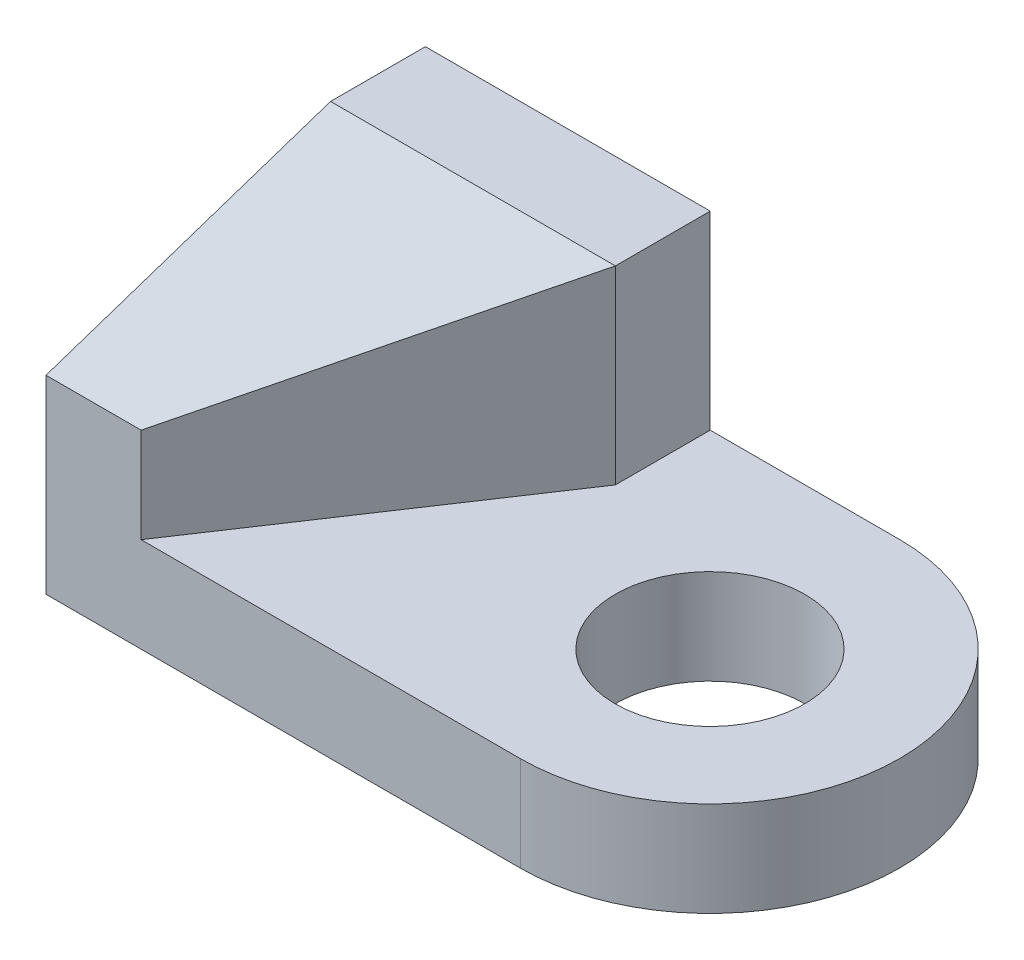
ISO-10303-21;
HEADER;
FILE_DESCRIPTION(('STEP AP214'),'2;1');
FILE_NAME('part.step','',(''),(''),'','','');
FILE_SCHEMA(('AUTOMOTIVE_DESIGN { 1 0 10303 214 1 1 1 1 }'));
ENDSEC;
DATA;
#1=APPLICATION_CONTEXT('core data for automotive mechanical design processes');
#2=APPLICATION_PROTOCOL_DEFINITION('international standard','automotive_design',2000,#1);
#3=PRODUCT_CONTEXT('',#1,'mechanical');
#4=PRODUCT('Part','Part','',(#3));
#5=PRODUCT_RELATED_PRODUCT_CATEGORY('part','',(#4));
#6=PRODUCT_DEFINITION_FORMATION('','',#4);
#7=PRODUCT_DEFINITION_CONTEXT('part definition',#1,'design');
#8=PRODUCT_DEFINITION('design','',#6,#7);
#9=PRODUCT_DEFINITION_SHAPE('','',#8);
#10=(LENGTH_UNIT() NAMED_UNIT(*) SI_UNIT(.MILLI.,.METRE.));
#11=(NAMED_UNIT(*) PLANE_ANGLE_UNIT() SI_UNIT($,.RADIAN.));
#12=(NAMED_UNIT(*) SI_UNIT($,.STERADIAN.) SOLID_ANGLE_UNIT());
#13=UNCERTAINTY_MEASURE_WITH_UNIT(LENGTH_MEASURE(1.E-05),#10,'distance_accuracy_value','');
#14=(GEOMETRIC_REPRESENTATION_CONTEXT(3) GLOBAL_UNCERTAINTY_ASSIGNED_CONTEXT((#13)) GLOBAL_UNIT_ASSIGNED_CONTEXT((#10,
#11,#12)) REPRESENTATION_CONTEXT('',''));
#15=CARTESIAN_POINT('',(0.,0.,0.));
#16=DIRECTION('',(0.,0.,1.));
#17=DIRECTION('',(1.,0.,0.));
#18=AXIS2_PLACEMENT_3D('',#15,#16,#17);
#19=CARTESIAN_POINT('',(-50.,10.,-20.));
#20=DIRECTION('',(1.,0.,0.));
#21=DIRECTION('',(0.,0.,-1.));
#22=AXIS2_PLACEMENT_3D('',#19,#20,#21);
#23=PLANE('',#22);
#24=DIRECTION('',(0.,-0.316227766016838,0.948683298050514));
#25=VECTOR('',#24,1.);
#26=CARTESIAN_POINT('',(-50.,31.,-13.));
#27=LINE('',#26,#25);
#28=CARTESIAN_POINT('',(-50.,30.,-10.));
#29=VERTEX_POINT('',#28);
#30=CARTESIAN_POINT('',(-50.,20.,20.));
#31=VERTEX_POINT('',#30);
#32=EDGE_CURVE('E141',#29,#31,#27,.T.);
#33=ORIENTED_EDGE('',*,*,#32,.F.);
#34=DIRECTION('',(0.,0.,-1.));
#35=VECTOR('',#34,1.);
#36=CARTESIAN_POINT('',(-50.,30.,20.));
#37=LINE('',#36,#35);
#38=CARTESIAN_POINT('',(-50.,30.,-20.));
#39=VERTEX_POINT('',#38);
#40=EDGE_CURVE('E150',#29,#39,#37,.T.);
#41=ORIENTED_EDGE('',*,*,#40,.T.);
#42=DIRECTION('',(0.,-1.,0.));
#43=VECTOR('',#42,1.);
#44=CARTESIAN_POINT('',(-50.,10.,-20.));
#45=LINE('',#44,#43);
#46=CARTESIAN_POINT('',(-50.,0.,-20.));
#47=VERTEX_POINT('',#46);
#48=EDGE_CURVE('E125',#39,#47,#45,.T.);
#49=ORIENTED_EDGE('',*,*,#48,.T.);
#50=DIRECTION('',(0.,0.,1.));
#51=VECTOR('',#50,1.);
#52=CARTESIAN_POINT('',(-50.,0.,-20.));
#53=LINE('',#52,#51);
#54=CARTESIAN_POINT('',(-50.,0.,20.));
#55=VERTEX_POINT('',#54);
#56=EDGE_CURVE('E97',#47,#55,#53,.T.);
#57=ORIENTED_EDGE('',*,*,#56,.T.);
#58=DIRECTION('',(0.,-1.,0.));
#59=VECTOR('',#58,1.);
#60=CARTESIAN_POINT('',(-50.,10.,20.));
#61=LINE('',#60,#59);
#62=EDGE_CURVE('E90',#31,#55,#61,.T.);
#63=ORIENTED_EDGE('',*,*,#62,.F.);
#64=EDGE_LOOP('',(#33,#41,#49,#57,#63));
#65=FACE_BOUND('',#64,.T.);
#66=ADVANCED_FACE('F40',(#65),#23,.F.);
#67=CARTESIAN_POINT('',(-50.,10.,20.));
#68=DIRECTION('',(0.,0.,-1.));
#69=DIRECTION('',(-1.,0.,0.));
#70=AXIS2_PLACEMENT_3D('',#67,#68,#69);
#71=PLANE('',#70);
#72=DIRECTION('',(1.,0.,0.));
#73=VECTOR('',#72,1.);
#74=CARTESIAN_POINT('',(-50.,10.,20.));
#75=LINE('',#74,#73);
#76=CARTESIAN_POINT('',(-39.9710585847802,10.,20.));
#77=VERTEX_POINT('',#76);
#78=CARTESIAN_POINT('',(0.,10.,20.));
#79=VERTEX_POINT('',#78);
#80=EDGE_CURVE('E64',#77,#79,#75,.T.);
#81=ORIENTED_EDGE('',*,*,#80,.F.);
#82=DIRECTION('',(0.,1.,0.));
#83=VECTOR('',#82,1.);
#84=CARTESIAN_POINT('',(-39.9710585847802,10.,20.));
#85=LINE('',#84,#83);
#86=CARTESIAN_POINT('',(-39.9710585847802,20.,20.));
#87=VERTEX_POINT('',#86);
#88=EDGE_CURVE('E195',#77,#87,#85,.T.);
#89=ORIENTED_EDGE('',*,*,#88,.T.);
#90=DIRECTION('',(1.,0.,0.));
#91=VECTOR('',#90,1.);
#92=CARTESIAN_POINT('',(-55.9710585847802,20.,20.));
#93=LINE('',#92,#91);
#94=EDGE_CURVE('E154',#31,#87,#93,.T.);
#95=ORIENTED_EDGE('',*,*,#94,.F.);
#96=ORIENTED_EDGE('',*,*,#62,.T.);
#97=DIRECTION('',(1.,0.,0.));
#98=VECTOR('',#97,1.);
#99=CARTESIAN_POINT('',(-50.,0.,20.));
#100=LINE('',#99,#98);
#101=CARTESIAN_POINT('',(0.,0.,20.));
#102=VERTEX_POINT('',#101);
#103=EDGE_CURVE('E83',#55,#102,#100,.T.);
#104=ORIENTED_EDGE('',*,*,#103,.T.);
#105=DIRECTION('',(0.,-1.,0.));
#106=VECTOR('',#105,1.);
#107=CARTESIAN_POINT('',(0.,10.,20.));
#108=LINE('',#107,#106);
#109=EDGE_CURVE('E86',#79,#102,#108,.T.);
#110=ORIENTED_EDGE('',*,*,#109,.F.);
#111=EDGE_LOOP('',(#81,#89,#95,#96,#104,#110));
#112=FACE_BOUND('',#111,.T.);
#113=ADVANCED_FACE('F85',(#112),#71,.F.);
#114=CARTESIAN_POINT('',(-19.9710585847802,30.,-20.));
#115=DIRECTION('',(1.,0.,0.));
#116=DIRECTION('',(0.,0.,-1.));
#117=AXIS2_PLACEMENT_3D('',#114,#115,#116);
#118=PLANE('',#117);
#119=DIRECTION('',(0.,1.,0.));
#120=VECTOR('',#119,1.);
#121=CARTESIAN_POINT('',(-19.9710585847802,10.,-10.));
#122=LINE('',#121,#120);
#123=CARTESIAN_POINT('',(-19.9710585847802,10.,-10.));
#124=VERTEX_POINT('',#123);
#125=CARTESIAN_POINT('',(-19.9710585847802,30.,-10.));
#126=VERTEX_POINT('',#125);
#127=EDGE_CURVE('E55',#124,#126,#122,.T.);
#128=ORIENTED_EDGE('',*,*,#127,.F.);
#129=DIRECTION('',(0.,0.,1.));
#130=VECTOR('',#129,1.);
#131=CARTESIAN_POINT('',(-19.9710585847802,10.,-20.));
#132=LINE('',#131,#130);
#133=CARTESIAN_POINT('',(-19.9710585847802,10.,-20.));
#134=VERTEX_POINT('',#133);
#135=EDGE_CURVE('E153',#134,#124,#132,.T.);
#136=ORIENTED_EDGE('',*,*,#135,.F.);
#137=DIRECTION('',(0.,-1.,0.));
#138=VECTOR('',#137,1.);
#139=CARTESIAN_POINT('',(-19.9710585847802,30.,-20.));
#140=LINE('',#139,#138);
#141=CARTESIAN_POINT('',(-19.9710585847802,30.,-20.));
#142=VERTEX_POINT('',#141);
#143=EDGE_CURVE('E161',#142,#134,#140,.T.);
#144=ORIENTED_EDGE('',*,*,#143,.F.);
#145=DIRECTION('',(0.,0.,1.));
#146=VECTOR('',#145,1.);
#147=CARTESIAN_POINT('',(-19.9710585847802,30.,-20.));
#148=LINE('',#147,#146);
#149=EDGE_CURVE('E162',#142,#126,#148,.T.);
#150=ORIENTED_EDGE('',*,*,#149,.T.);
#151=EDGE_LOOP('',(#128,#136,#144,#150));
#152=FACE_BOUND('',#151,.T.);
#153=ADVANCED_FACE('F190',(#152),#118,.T.);
#154=CARTESIAN_POINT('',(0.,30.,0.));
#155=DIRECTION('',(0.,-1.,0.));
#156=DIRECTION('',(0.,0.,-1.));
#157=AXIS2_PLACEMENT_3D('',#154,#155,#156);
#158=PLANE('',#157);
#159=DIRECTION('',(-1.,0.,0.));
#160=VECTOR('',#159,1.);
#161=CARTESIAN_POINT('',(0.,30.,-10.));
#162=LINE('',#161,#160);
#163=EDGE_CURVE('E49',#126,#29,#162,.T.);
#164=ORIENTED_EDGE('',*,*,#163,.F.);
#165=ORIENTED_EDGE('',*,*,#149,.F.);
#166=DIRECTION('',(1.,0.,0.));
#167=VECTOR('',#166,1.);
#168=CARTESIAN_POINT('',(-50.,30.,-20.));
#169=LINE('',#168,#167);
#170=EDGE_CURVE('E159',#39,#142,#169,.T.);
#171=ORIENTED_EDGE('',*,*,#170,.F.);
#172=ORIENTED_EDGE('',*,*,#40,.F.);
#173=EDGE_LOOP('',(#164,#165,#171,#172));
#174=FACE_BOUND('',#173,.T.);
#175=ADVANCED_FACE('F157',(#174),#158,.F.);
#176=CARTESIAN_POINT('',(0.,10.,0.));
#177=DIRECTION('',(0.,1.,0.));
#178=DIRECTION('',(0.,0.,1.));
#179=AXIS2_PLACEMENT_3D('',#176,#177,#178);
#180=PLANE('',#179);
#181=CARTESIAN_POINT('',(0.,10.,0.));
#182=DIRECTION('',(0.,1.,0.));
#183=DIRECTION('',(0.,0.,1.));
#184=AXIS2_PLACEMENT_3D('',#181,#182,#183);
#185=CIRCLE('',#184,10.);
#186=CARTESIAN_POINT('',(0.,10.,10.));
#187=VERTEX_POINT('',#186);
#188=EDGE_CURVE('E110',#187,#187,#185,.T.);
#189=ORIENTED_EDGE('',*,*,#188,.F.);
#190=EDGE_LOOP('',(#189));
#191=FACE_BOUND('',#190,.T.);
#192=DIRECTION('',(-1.,0.,0.));
#193=VECTOR('',#192,1.);
#194=CARTESIAN_POINT('',(0.,10.,-20.));
#195=LINE('',#194,#193);
#196=CARTESIAN_POINT('',(0.,10.,-20.));
#197=VERTEX_POINT('',#196);
#198=EDGE_CURVE('E178',#197,#134,#195,.T.);
#199=ORIENTED_EDGE('',*,*,#198,.T.);
#200=ORIENTED_EDGE('',*,*,#135,.T.);
#201=DIRECTION('',(-0.554700196225229,0.,0.832050294337843));
#202=VECTOR('',#201,1.);
#203=CARTESIAN_POINT('',(-19.9710585847802,10.,-10.));
#204=LINE('',#203,#202);
#205=EDGE_CURVE('E201',#124,#77,#204,.T.);
#206=ORIENTED_EDGE('',*,*,#205,.T.);
#207=ORIENTED_EDGE('',*,*,#80,.T.);
#208=CARTESIAN_POINT('',(0.,10.,0.));
#209=DIRECTION('',(0.,1.,0.));
#210=DIRECTION('',(0.,0.,1.));
#211=AXIS2_PLACEMENT_3D('',#208,#209,#210);
#212=CIRCLE('',#211,20.);
#213=EDGE_CURVE('E96',#79,#197,#212,.T.);
#214=ORIENTED_EDGE('',*,*,#213,.T.);
#215=EDGE_LOOP('',(#199,#200,#206,#207,#214));
#216=FACE_BOUND('',#215,.T.);
#217=ADVANCED_FACE('F182',(#191,#216),#180,.T.);
#218=CARTESIAN_POINT('',(0.,0.,0.));
#219=DIRECTION('',(0.,1.,0.));
#220=DIRECTION('',(0.,0.,1.));
#221=AXIS2_PLACEMENT_3D('',#218,#219,#220);
#222=PLANE('',#221);
#223=CARTESIAN_POINT('',(0.,0.,0.));
#224=DIRECTION('',(0.,1.,0.));
#225=DIRECTION('',(0.,0.,1.));
#226=AXIS2_PLACEMENT_3D('',#223,#224,#225);
#227=CIRCLE('',#226,20.);
#228=CARTESIAN_POINT('',(0.,0.,-20.));
#229=VERTEX_POINT('',#228);
#230=EDGE_CURVE('E102',#102,#229,#227,.T.);
#231=ORIENTED_EDGE('',*,*,#230,.F.);
#232=ORIENTED_EDGE('',*,*,#103,.F.);
#233=ORIENTED_EDGE('',*,*,#56,.F.);
#234=DIRECTION('',(-1.,0.,0.));
#235=VECTOR('',#234,1.);
#236=CARTESIAN_POINT('',(0.,0.,-20.));
#237=LINE('',#236,#235);
#238=EDGE_CURVE('E107',#229,#47,#237,.T.);
#239=ORIENTED_EDGE('',*,*,#238,.F.);
#240=EDGE_LOOP('',(#231,#232,#233,#239));
#241=FACE_BOUND('',#240,.T.);
#242=CARTESIAN_POINT('',(0.,0.,0.));
#243=DIRECTION('',(0.,1.,0.));
#244=DIRECTION('',(0.,0.,1.));
#245=AXIS2_PLACEMENT_3D('',#242,#243,#244);
#246=CIRCLE('',#245,10.);
#247=CARTESIAN_POINT('',(0.,0.,10.));
#248=VERTEX_POINT('',#247);
#249=EDGE_CURVE('E116',#248,#248,#246,.T.);
#250=ORIENTED_EDGE('',*,*,#249,.T.);
#251=EDGE_LOOP('',(#250));
#252=FACE_BOUND('',#251,.T.);
#253=ADVANCED_FACE('F105',(#241,#252),#222,.F.);
#254=CARTESIAN_POINT('',(0.,10.,0.));
#255=DIRECTION('',(0.,-1.,0.));
#256=DIRECTION('',(0.,0.,-1.));
#257=AXIS2_PLACEMENT_3D('',#254,#255,#256);
#258=CYLINDRICAL_SURFACE('',#257,20.);
#259=ORIENTED_EDGE('',*,*,#230,.T.);
#260=DIRECTION('',(0.,-1.,0.));
#261=VECTOR('',#260,1.);
#262=CARTESIAN_POINT('',(0.,10.,-20.));
#263=LINE('',#262,#261);
#264=EDGE_CURVE('E129',#197,#229,#263,.T.);
#265=ORIENTED_EDGE('',*,*,#264,.F.);
#266=ORIENTED_EDGE('',*,*,#213,.F.);
#267=ORIENTED_EDGE('',*,*,#109,.T.);
#268=EDGE_LOOP('',(#259,#265,#266,#267));
#269=FACE_BOUND('',#268,.T.);
#270=ADVANCED_FACE('F42',(#269),#258,.T.);
#271=CARTESIAN_POINT('',(0.,10.,-20.));
#272=DIRECTION('',(0.,0.,1.));
#273=DIRECTION('',(1.,0.,0.));
#274=AXIS2_PLACEMENT_3D('',#271,#272,#273);
#275=PLANE('',#274);
#276=ORIENTED_EDGE('',*,*,#238,.T.);
#277=ORIENTED_EDGE('',*,*,#48,.F.);
#278=ORIENTED_EDGE('',*,*,#170,.T.);
#279=ORIENTED_EDGE('',*,*,#143,.T.);
#280=ORIENTED_EDGE('',*,*,#198,.F.);
#281=ORIENTED_EDGE('',*,*,#264,.T.);
#282=EDGE_LOOP('',(#276,#277,#278,#279,#280,#281));
#283=FACE_BOUND('',#282,.T.);
#284=ADVANCED_FACE('F187',(#283),#275,.F.);
#285=CARTESIAN_POINT('',(0.,10.,0.));
#286=DIRECTION('',(0.,-1.,0.));
#287=DIRECTION('',(0.,0.,-1.));
#288=AXIS2_PLACEMENT_3D('',#285,#286,#287);
#289=CYLINDRICAL_SURFACE('',#288,10.);
#290=ORIENTED_EDGE('',*,*,#188,.T.);
#291=EDGE_LOOP('',(#290));
#292=FACE_BOUND('',#291,.T.);
#293=ORIENTED_EDGE('',*,*,#249,.F.);
#294=EDGE_LOOP('',(#293));
#295=FACE_BOUND('',#294,.T.);
#296=ADVANCED_FACE('F218',(#292,#295),#289,.F.);
#297=CARTESIAN_POINT('',(-55.9710585847802,30.,-10.));
#298=DIRECTION('',(0.,0.948683298050514,0.316227766016838));
#299=DIRECTION('',(0.,-0.316227766016838,0.948683298050514));
#300=AXIS2_PLACEMENT_3D('',#297,#298,#299);
#301=PLANE('',#300);
#302=DIRECTION('',(-0.534522483824849,-0.267261241912424,0.801783725737273));
#303=VECTOR('',#302,1.);
#304=CARTESIAN_POINT('',(-30.2567728704945,24.8571428571429,5.42857142857143));
#305=LINE('',#304,#303);
#306=EDGE_CURVE('E12',#126,#87,#305,.T.);
#307=ORIENTED_EDGE('',*,*,#306,.F.);
#308=ORIENTED_EDGE('',*,*,#163,.T.);
#309=ORIENTED_EDGE('',*,*,#32,.T.);
#310=ORIENTED_EDGE('',*,*,#94,.T.);
#311=EDGE_LOOP('',(#307,#308,#309,#310));
#312=FACE_BOUND('',#311,.T.);
#313=ADVANCED_FACE('F138',(#312),#301,.T.);
#314=CARTESIAN_POINT('',(-19.9710585847802,10.,-10.));
#315=DIRECTION('',(-0.832050294337844,0.,-0.554700196225229));
#316=DIRECTION('',(-0.554700196225229,0.,0.832050294337844));
#317=AXIS2_PLACEMENT_3D('',#314,#315,#316);
#318=PLANE('',#317);
#319=ORIENTED_EDGE('',*,*,#306,.T.);
#320=ORIENTED_EDGE('',*,*,#88,.F.);
#321=ORIENTED_EDGE('',*,*,#205,.F.);
#322=ORIENTED_EDGE('',*,*,#127,.T.);
#323=EDGE_LOOP('',(#319,#320,#321,#322));
#324=FACE_BOUND('',#323,.T.);
#325=ADVANCED_FACE('F208',(#324),#318,.F.);
#326=CLOSED_SHELL('',(#66,#113,#153,#175,#217,#253,#270,#284,#296,#313,#325));
#327=MANIFOLD_SOLID_BREP('B2',#326);
#328=ADVANCED_BREP_SHAPE_REPRESENTATION('',(#18,#327),#14);
#329=SHAPE_DEFINITION_REPRESENTATION(#9,#328);
ENDSEC;
END-ISO-10303-21;
